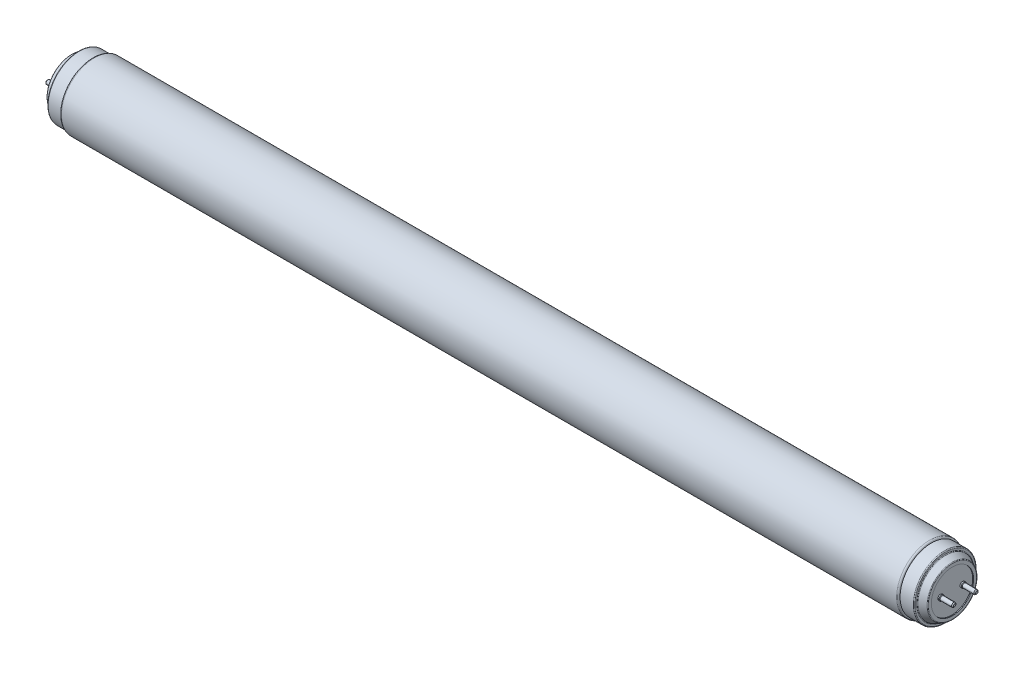
ISO-10303-21;
HEADER;
FILE_DESCRIPTION(('STEP AP214'),'2;1');
FILE_NAME('part.step','',(''),(''),'','','');
FILE_SCHEMA(('AUTOMOTIVE_DESIGN { 1 0 10303 214 1 1 1 1 }'));
ENDSEC;
DATA;
#1=APPLICATION_CONTEXT('core data for automotive mechanical design processes');
#2=APPLICATION_PROTOCOL_DEFINITION('international standard','automotive_design',2000,#1);
#3=PRODUCT_CONTEXT('',#1,'mechanical');
#4=PRODUCT('Part','Part','',(#3));
#5=PRODUCT_RELATED_PRODUCT_CATEGORY('part','',(#4));
#6=PRODUCT_DEFINITION_FORMATION('','',#4);
#7=PRODUCT_DEFINITION_CONTEXT('part definition',#1,'design');
#8=PRODUCT_DEFINITION('design','',#6,#7);
#9=PRODUCT_DEFINITION_SHAPE('','',#8);
#10=(LENGTH_UNIT() NAMED_UNIT(*) SI_UNIT(.MILLI.,.METRE.));
#11=(NAMED_UNIT(*) PLANE_ANGLE_UNIT() SI_UNIT($,.RADIAN.));
#12=(NAMED_UNIT(*) SI_UNIT($,.STERADIAN.) SOLID_ANGLE_UNIT());
#13=UNCERTAINTY_MEASURE_WITH_UNIT(LENGTH_MEASURE(1.E-05),#10,'distance_accuracy_value','');
#14=(GEOMETRIC_REPRESENTATION_CONTEXT(3) GLOBAL_UNCERTAINTY_ASSIGNED_CONTEXT((#13)) GLOBAL_UNIT_ASSIGNED_CONTEXT((#10,
#11,#12)) REPRESENTATION_CONTEXT('',''));
#15=CARTESIAN_POINT('',(0.,0.,0.));
#16=DIRECTION('',(0.,0.,1.));
#17=DIRECTION('',(1.,0.,0.));
#18=AXIS2_PLACEMENT_3D('',#15,#16,#17);
#19=CARTESIAN_POINT('',(487.5,-12.,0.));
#20=DIRECTION('',(-1.,0.,0.));
#21=DIRECTION('',(0.,0.,1.));
#22=AXIS2_PLACEMENT_3D('',#19,#20,#21);
#23=PLANE('',#22);
#24=CARTESIAN_POINT('',(487.5,0.,-6.3));
#25=DIRECTION('',(-1.,0.,0.));
#26=DIRECTION('',(0.,0.,1.));
#27=AXIS2_PLACEMENT_3D('',#24,#25,#26);
#28=CIRCLE('',#27,1.5);
#29=CARTESIAN_POINT('',(487.5,0.,-4.8));
#30=VERTEX_POINT('',#29);
#31=EDGE_CURVE('E77',#30,#30,#28,.F.);
#32=ORIENTED_EDGE('',*,*,#31,.F.);
#33=EDGE_LOOP('',(#32));
#34=FACE_BOUND('',#33,.T.);
#35=CARTESIAN_POINT('',(487.5,0.,0.));
#36=DIRECTION('',(1.,0.,0.));
#37=DIRECTION('',(0.,0.,-1.));
#38=AXIS2_PLACEMENT_3D('',#35,#36,#37);
#39=CIRCLE('',#38,12.);
#40=CARTESIAN_POINT('',(487.5,0.,-12.));
#41=VERTEX_POINT('',#40);
#42=EDGE_CURVE('E99',#41,#41,#39,.T.);
#43=ORIENTED_EDGE('',*,*,#42,.T.);
#44=EDGE_LOOP('',(#43));
#45=FACE_BOUND('',#44,.T.);
#46=CARTESIAN_POINT('',(487.5,0.,6.3));
#47=DIRECTION('',(-1.,0.,0.));
#48=DIRECTION('',(0.,0.,1.));
#49=AXIS2_PLACEMENT_3D('',#46,#47,#48);
#50=CIRCLE('',#49,1.5);
#51=CARTESIAN_POINT('',(487.5,0.,7.8));
#52=VERTEX_POINT('',#51);
#53=EDGE_CURVE('E74',#52,#52,#50,.F.);
#54=ORIENTED_EDGE('',*,*,#53,.F.);
#55=EDGE_LOOP('',(#54));
#56=FACE_BOUND('',#55,.T.);
#57=ADVANCED_FACE('F30',(#34,#45,#56),#23,.F.);
#58=CARTESIAN_POINT('',(-11.5,-12.,0.));
#59=DIRECTION('',(1.,0.,0.));
#60=DIRECTION('',(0.,0.,-1.));
#61=AXIS2_PLACEMENT_3D('',#58,#59,#60);
#62=PLANE('',#61);
#63=CARTESIAN_POINT('',(-11.5,0.,-6.3));
#64=DIRECTION('',(1.,0.,0.));
#65=DIRECTION('',(0.,0.,-1.));
#66=AXIS2_PLACEMENT_3D('',#63,#64,#65);
#67=CIRCLE('',#66,1.5);
#68=CARTESIAN_POINT('',(-11.5,0.,-7.8));
#69=VERTEX_POINT('',#68);
#70=EDGE_CURVE('E90',#69,#69,#67,.F.);
#71=ORIENTED_EDGE('',*,*,#70,.F.);
#72=EDGE_LOOP('',(#71));
#73=FACE_BOUND('',#72,.T.);
#74=CARTESIAN_POINT('',(-11.5,0.,0.));
#75=DIRECTION('',(1.,0.,0.));
#76=DIRECTION('',(0.,0.,-1.));
#77=AXIS2_PLACEMENT_3D('',#74,#75,#76);
#78=CIRCLE('',#77,12.);
#79=CARTESIAN_POINT('',(-11.5,0.,-12.));
#80=VERTEX_POINT('',#79);
#81=EDGE_CURVE('E96',#80,#80,#78,.T.);
#82=ORIENTED_EDGE('',*,*,#81,.F.);
#83=EDGE_LOOP('',(#82));
#84=FACE_BOUND('',#83,.T.);
#85=CARTESIAN_POINT('',(-11.5,0.,6.3));
#86=DIRECTION('',(1.,0.,0.));
#87=DIRECTION('',(0.,0.,-1.));
#88=AXIS2_PLACEMENT_3D('',#85,#86,#87);
#89=CIRCLE('',#88,1.5);
#90=CARTESIAN_POINT('',(-11.5,0.,4.8));
#91=VERTEX_POINT('',#90);
#92=EDGE_CURVE('E84',#91,#91,#89,.F.);
#93=ORIENTED_EDGE('',*,*,#92,.F.);
#94=EDGE_LOOP('',(#93));
#95=FACE_BOUND('',#94,.T.);
#96=ADVANCED_FACE('F273',(#73,#84,#95),#62,.F.);
#97=CARTESIAN_POINT('',(-11.5,0.,0.));
#98=DIRECTION('',(1.,0.,0.));
#99=DIRECTION('',(0.,0.,-1.));
#100=AXIS2_PLACEMENT_3D('',#97,#98,#99);
#101=CYLINDRICAL_SURFACE('',#100,12.);
#102=CARTESIAN_POINT('',(-12.,0.,0.));
#103=DIRECTION('',(1.,0.,0.));
#104=DIRECTION('',(0.,0.,-1.));
#105=AXIS2_PLACEMENT_3D('',#102,#103,#104);
#106=CIRCLE('',#105,12.);
#107=CARTESIAN_POINT('',(-12.,0.,-12.));
#108=VERTEX_POINT('',#107);
#109=EDGE_CURVE('E102',#108,#108,#106,.T.);
#110=ORIENTED_EDGE('',*,*,#109,.F.);
#111=EDGE_LOOP('',(#110));
#112=FACE_BOUND('',#111,.T.);
#113=ORIENTED_EDGE('',*,*,#81,.T.);
#114=EDGE_LOOP('',(#113));
#115=FACE_BOUND('',#114,.T.);
#116=ADVANCED_FACE('F267',(#112,#115),#101,.F.);
#117=CARTESIAN_POINT('',(-12.,-13.6909830056251,0.));
#118=DIRECTION('',(1.,0.,0.));
#119=DIRECTION('',(0.,0.,-1.));
#120=AXIS2_PLACEMENT_3D('',#117,#118,#119);
#121=PLANE('',#120);
#122=CARTESIAN_POINT('',(-12.,0.,0.));
#123=DIRECTION('',(1.,0.,0.));
#124=DIRECTION('',(0.,0.,-1.));
#125=AXIS2_PLACEMENT_3D('',#122,#123,#124);
#126=CIRCLE('',#125,13.6909830056251);
#127=CARTESIAN_POINT('',(-12.,0.,-13.6909830056251));
#128=VERTEX_POINT('',#127);
#129=EDGE_CURVE('E105',#128,#128,#126,.T.);
#130=ORIENTED_EDGE('',*,*,#129,.F.);
#131=EDGE_LOOP('',(#130));
#132=FACE_BOUND('',#131,.T.);
#133=ORIENTED_EDGE('',*,*,#109,.T.);
#134=EDGE_LOOP('',(#133));
#135=FACE_BOUND('',#134,.T.);
#136=ADVANCED_FACE('F261',(#132,#135),#121,.F.);
#137=CARTESIAN_POINT('',(-11.5,0.,0.));
#138=DIRECTION('',(1.,0.,0.));
#139=DIRECTION('',(0.,0.,-1.));
#140=AXIS2_PLACEMENT_3D('',#137,#138,#139);
#141=TOROIDAL_SURFACE('',#140,13.6909830056251,0.5);
#142=CARTESIAN_POINT('',(-11.72360679775,0.,0.));
#143=DIRECTION('',(1.,0.,0.));
#144=DIRECTION('',(0.,0.,-1.));
#145=AXIS2_PLACEMENT_3D('',#142,#143,#144);
#146=CIRCLE('',#145,14.138196601125);
#147=CARTESIAN_POINT('',(-11.72360679775,0.,-14.138196601125));
#148=VERTEX_POINT('',#147);
#149=EDGE_CURVE('E108',#148,#148,#146,.T.);
#150=ORIENTED_EDGE('',*,*,#149,.F.);
#151=EDGE_LOOP('',(#150));
#152=FACE_BOUND('',#151,.T.);
#153=ORIENTED_EDGE('',*,*,#129,.T.);
#154=EDGE_LOOP('',(#153));
#155=FACE_BOUND('',#154,.T.);
#156=ADVANCED_FACE('F255',(#152,#155),#141,.T.);
#157=CARTESIAN_POINT('',(-11.72360679775,0.,0.));
#158=DIRECTION('',(1.,0.,0.));
#159=DIRECTION('',(0.,0.,-1.));
#160=AXIS2_PLACEMENT_3D('',#157,#158,#159);
#161=CONICAL_SURFACE('',#160,14.138196601125,0.463647609000806);
#162=CARTESIAN_POINT('',(-8.27639320225002,0.,0.));
#163=DIRECTION('',(1.,0.,0.));
#164=DIRECTION('',(0.,0.,-1.));
#165=AXIS2_PLACEMENT_3D('',#162,#163,#164);
#166=CIRCLE('',#165,15.861803398875);
#167=CARTESIAN_POINT('',(-8.27639320225002,0.,-15.861803398875));
#168=VERTEX_POINT('',#167);
#169=EDGE_CURVE('E111',#168,#168,#166,.T.);
#170=ORIENTED_EDGE('',*,*,#169,.F.);
#171=EDGE_LOOP('',(#170));
#172=FACE_BOUND('',#171,.T.);
#173=ORIENTED_EDGE('',*,*,#149,.T.);
#174=EDGE_LOOP('',(#173));
#175=FACE_BOUND('',#174,.T.);
#176=ADVANCED_FACE('F249',(#172,#175),#161,.T.);
#177=CARTESIAN_POINT('',(-8.5,0.,0.));
#178=DIRECTION('',(1.,0.,0.));
#179=DIRECTION('',(0.,0.,-1.));
#180=AXIS2_PLACEMENT_3D('',#177,#178,#179);
#181=TOROIDAL_SURFACE('',#180,16.309016994375,0.500000000000001);
#182=CARTESIAN_POINT('',(-8.,0.,0.));
#183=DIRECTION('',(1.,0.,0.));
#184=DIRECTION('',(0.,0.,-1.));
#185=AXIS2_PLACEMENT_3D('',#182,#183,#184);
#186=CIRCLE('',#185,16.309016994375);
#187=CARTESIAN_POINT('',(-8.,0.,-16.309016994375));
#188=VERTEX_POINT('',#187);
#189=EDGE_CURVE('E114',#188,#188,#186,.T.);
#190=ORIENTED_EDGE('',*,*,#189,.F.);
#191=EDGE_LOOP('',(#190));
#192=FACE_BOUND('',#191,.T.);
#193=ORIENTED_EDGE('',*,*,#169,.T.);
#194=EDGE_LOOP('',(#193));
#195=FACE_BOUND('',#194,.T.);
#196=ADVANCED_FACE('F243',(#192,#195),#181,.F.);
#197=CARTESIAN_POINT('',(-8.,-17.25,0.));
#198=DIRECTION('',(1.,0.,0.));
#199=DIRECTION('',(0.,0.,-1.));
#200=AXIS2_PLACEMENT_3D('',#197,#198,#199);
#201=PLANE('',#200);
#202=CARTESIAN_POINT('',(-8.,0.,0.));
#203=DIRECTION('',(1.,0.,0.));
#204=DIRECTION('',(0.,0.,-1.));
#205=AXIS2_PLACEMENT_3D('',#202,#203,#204);
#206=CIRCLE('',#205,17.25);
#207=CARTESIAN_POINT('',(-8.,0.,-17.25));
#208=VERTEX_POINT('',#207);
#209=EDGE_CURVE('E117',#208,#208,#206,.T.);
#210=ORIENTED_EDGE('',*,*,#209,.F.);
#211=EDGE_LOOP('',(#210));
#212=FACE_BOUND('',#211,.T.);
#213=ORIENTED_EDGE('',*,*,#189,.T.);
#214=EDGE_LOOP('',(#213));
#215=FACE_BOUND('',#214,.T.);
#216=ADVANCED_FACE('F237',(#212,#215),#201,.F.);
#217=CARTESIAN_POINT('',(-7.5,0.,0.));
#218=DIRECTION('',(1.,0.,0.));
#219=DIRECTION('',(0.,0.,-1.));
#220=AXIS2_PLACEMENT_3D('',#217,#218,#219);
#221=TOROIDAL_SURFACE('',#220,17.25,0.5);
#222=CARTESIAN_POINT('',(-7.49999999999999,0.,0.));
#223=DIRECTION('',(1.,0.,0.));
#224=DIRECTION('',(0.,0.,-1.));
#225=AXIS2_PLACEMENT_3D('',#222,#223,#224);
#226=CIRCLE('',#225,17.75);
#227=CARTESIAN_POINT('',(-7.49999999999999,0.,-17.75));
#228=VERTEX_POINT('',#227);
#229=EDGE_CURVE('E120',#228,#228,#226,.T.);
#230=ORIENTED_EDGE('',*,*,#229,.F.);
#231=EDGE_LOOP('',(#230));
#232=FACE_BOUND('',#231,.T.);
#233=ORIENTED_EDGE('',*,*,#209,.T.);
#234=EDGE_LOOP('',(#233));
#235=FACE_BOUND('',#234,.T.);
#236=ADVANCED_FACE('F231',(#232,#235),#221,.T.);
#237=CARTESIAN_POINT('',(-11.5,0.,0.));
#238=DIRECTION('',(1.,0.,0.));
#239=DIRECTION('',(0.,0.,-1.));
#240=AXIS2_PLACEMENT_3D('',#237,#238,#239);
#241=CYLINDRICAL_SURFACE('',#240,17.75);
#242=CARTESIAN_POINT('',(0.,0.,0.));
#243=DIRECTION('',(1.,0.,0.));
#244=DIRECTION('',(0.,0.,-1.));
#245=AXIS2_PLACEMENT_3D('',#242,#243,#244);
#246=CIRCLE('',#245,17.75);
#247=CARTESIAN_POINT('',(0.,0.,-17.75));
#248=VERTEX_POINT('',#247);
#249=EDGE_CURVE('E123',#248,#248,#246,.T.);
#250=ORIENTED_EDGE('',*,*,#249,.F.);
#251=EDGE_LOOP('',(#250));
#252=FACE_BOUND('',#251,.T.);
#253=ORIENTED_EDGE('',*,*,#229,.T.);
#254=EDGE_LOOP('',(#253));
#255=FACE_BOUND('',#254,.T.);
#256=ADVANCED_FACE('F225',(#252,#255),#241,.T.);
#257=CARTESIAN_POINT('',(0.950000000000002,0.,0.));
#258=DIRECTION('',(1.,0.,0.));
#259=DIRECTION('',(0.,0.,-1.));
#260=AXIS2_PLACEMENT_3D('',#257,#258,#259);
#261=TOROIDAL_SURFACE('',#260,17.75,0.950000000000001);
#262=CARTESIAN_POINT('',(0.950000000000001,0.,0.));
#263=DIRECTION('',(1.,0.,0.));
#264=DIRECTION('',(0.,0.,-1.));
#265=AXIS2_PLACEMENT_3D('',#262,#263,#264);
#266=CIRCLE('',#265,18.7);
#267=CARTESIAN_POINT('',(0.950000000000001,0.,-18.7));
#268=VERTEX_POINT('',#267);
#269=EDGE_CURVE('E126',#268,#268,#266,.T.);
#270=ORIENTED_EDGE('',*,*,#269,.F.);
#271=EDGE_LOOP('',(#270));
#272=FACE_BOUND('',#271,.T.);
#273=ORIENTED_EDGE('',*,*,#249,.T.);
#274=EDGE_LOOP('',(#273));
#275=FACE_BOUND('',#274,.T.);
#276=ADVANCED_FACE('F219',(#272,#275),#261,.T.);
#277=CARTESIAN_POINT('',(-11.5,0.,0.));
#278=DIRECTION('',(1.,0.,0.));
#279=DIRECTION('',(0.,0.,-1.));
#280=AXIS2_PLACEMENT_3D('',#277,#278,#279);
#281=CYLINDRICAL_SURFACE('',#280,18.7);
#282=CARTESIAN_POINT('',(475.05,0.,0.));
#283=DIRECTION('',(1.,0.,0.));
#284=DIRECTION('',(0.,0.,-1.));
#285=AXIS2_PLACEMENT_3D('',#282,#283,#284);
#286=CIRCLE('',#285,18.7);
#287=CARTESIAN_POINT('',(475.05,0.,-18.7));
#288=VERTEX_POINT('',#287);
#289=EDGE_CURVE('E129',#288,#288,#286,.T.);
#290=ORIENTED_EDGE('',*,*,#289,.F.);
#291=EDGE_LOOP('',(#290));
#292=FACE_BOUND('',#291,.T.);
#293=ORIENTED_EDGE('',*,*,#269,.T.);
#294=EDGE_LOOP('',(#293));
#295=FACE_BOUND('',#294,.T.);
#296=ADVANCED_FACE('F213',(#292,#295),#281,.T.);
#297=CARTESIAN_POINT('',(475.05,0.,0.));
#298=DIRECTION('',(1.,0.,0.));
#299=DIRECTION('',(0.,0.,-1.));
#300=AXIS2_PLACEMENT_3D('',#297,#298,#299);
#301=TOROIDAL_SURFACE('',#300,17.75,0.950000000000005);
#302=CARTESIAN_POINT('',(476.,0.,0.));
#303=DIRECTION('',(1.,0.,0.));
#304=DIRECTION('',(0.,0.,-1.));
#305=AXIS2_PLACEMENT_3D('',#302,#303,#304);
#306=CIRCLE('',#305,17.75);
#307=CARTESIAN_POINT('',(476.,0.,-17.75));
#308=VERTEX_POINT('',#307);
#309=EDGE_CURVE('E132',#308,#308,#306,.T.);
#310=ORIENTED_EDGE('',*,*,#309,.F.);
#311=EDGE_LOOP('',(#310));
#312=FACE_BOUND('',#311,.T.);
#313=ORIENTED_EDGE('',*,*,#289,.T.);
#314=EDGE_LOOP('',(#313));
#315=FACE_BOUND('',#314,.T.);
#316=ADVANCED_FACE('F207',(#312,#315),#301,.T.);
#317=CARTESIAN_POINT('',(-11.5,0.,0.));
#318=DIRECTION('',(1.,0.,0.));
#319=DIRECTION('',(0.,0.,-1.));
#320=AXIS2_PLACEMENT_3D('',#317,#318,#319);
#321=CYLINDRICAL_SURFACE('',#320,17.75);
#322=CARTESIAN_POINT('',(483.5,0.,0.));
#323=DIRECTION('',(1.,0.,0.));
#324=DIRECTION('',(0.,0.,-1.));
#325=AXIS2_PLACEMENT_3D('',#322,#323,#324);
#326=CIRCLE('',#325,17.75);
#327=CARTESIAN_POINT('',(483.5,0.,-17.75));
#328=VERTEX_POINT('',#327);
#329=EDGE_CURVE('E135',#328,#328,#326,.T.);
#330=ORIENTED_EDGE('',*,*,#329,.F.);
#331=EDGE_LOOP('',(#330));
#332=FACE_BOUND('',#331,.T.);
#333=ORIENTED_EDGE('',*,*,#309,.T.);
#334=EDGE_LOOP('',(#333));
#335=FACE_BOUND('',#334,.T.);
#336=ADVANCED_FACE('F201',(#332,#335),#321,.T.);
#337=CARTESIAN_POINT('',(483.5,0.,0.));
#338=DIRECTION('',(1.,0.,0.));
#339=DIRECTION('',(0.,0.,-1.));
#340=AXIS2_PLACEMENT_3D('',#337,#338,#339);
#341=TOROIDAL_SURFACE('',#340,17.25,0.500000000000002);
#342=CARTESIAN_POINT('',(484.,0.,0.));
#343=DIRECTION('',(1.,0.,0.));
#344=DIRECTION('',(0.,0.,-1.));
#345=AXIS2_PLACEMENT_3D('',#342,#343,#344);
#346=CIRCLE('',#345,17.25);
#347=CARTESIAN_POINT('',(484.,0.,-17.25));
#348=VERTEX_POINT('',#347);
#349=EDGE_CURVE('E138',#348,#348,#346,.T.);
#350=ORIENTED_EDGE('',*,*,#349,.F.);
#351=EDGE_LOOP('',(#350));
#352=FACE_BOUND('',#351,.T.);
#353=ORIENTED_EDGE('',*,*,#329,.T.);
#354=EDGE_LOOP('',(#353));
#355=FACE_BOUND('',#354,.T.);
#356=ADVANCED_FACE('F195',(#352,#355),#341,.T.);
#357=CARTESIAN_POINT('',(484.,-17.25,0.));
#358=DIRECTION('',(-1.,0.,0.));
#359=DIRECTION('',(0.,0.,1.));
#360=AXIS2_PLACEMENT_3D('',#357,#358,#359);
#361=PLANE('',#360);
#362=CARTESIAN_POINT('',(484.,0.,0.));
#363=DIRECTION('',(1.,0.,0.));
#364=DIRECTION('',(0.,0.,-1.));
#365=AXIS2_PLACEMENT_3D('',#362,#363,#364);
#366=CIRCLE('',#365,16.3090169943749);
#367=CARTESIAN_POINT('',(484.,0.,-16.3090169943749));
#368=VERTEX_POINT('',#367);
#369=EDGE_CURVE('E141',#368,#368,#366,.T.);
#370=ORIENTED_EDGE('',*,*,#369,.F.);
#371=EDGE_LOOP('',(#370));
#372=FACE_BOUND('',#371,.T.);
#373=ORIENTED_EDGE('',*,*,#349,.T.);
#374=EDGE_LOOP('',(#373));
#375=FACE_BOUND('',#374,.T.);
#376=ADVANCED_FACE('F189',(#372,#375),#361,.F.);
#377=CARTESIAN_POINT('',(484.5,0.,0.));
#378=DIRECTION('',(1.,0.,0.));
#379=DIRECTION('',(0.,0.,-1.));
#380=AXIS2_PLACEMENT_3D('',#377,#378,#379);
#381=TOROIDAL_SURFACE('',#380,16.3090169943749,0.500000000000009);
#382=CARTESIAN_POINT('',(484.27639320225,0.,0.));
#383=DIRECTION('',(1.,0.,0.));
#384=DIRECTION('',(0.,0.,-1.));
#385=AXIS2_PLACEMENT_3D('',#382,#383,#384);
#386=CIRCLE('',#385,15.861803398875);
#387=CARTESIAN_POINT('',(484.27639320225,0.,-15.861803398875));
#388=VERTEX_POINT('',#387);
#389=EDGE_CURVE('E144',#388,#388,#386,.T.);
#390=ORIENTED_EDGE('',*,*,#389,.F.);
#391=EDGE_LOOP('',(#390));
#392=FACE_BOUND('',#391,.T.);
#393=ORIENTED_EDGE('',*,*,#369,.T.);
#394=EDGE_LOOP('',(#393));
#395=FACE_BOUND('',#394,.T.);
#396=ADVANCED_FACE('F183',(#392,#395),#381,.F.);
#397=CARTESIAN_POINT('',(484.27639320225,0.,0.));
#398=DIRECTION('',(-1.,0.,0.));
#399=DIRECTION('',(0.,0.,1.));
#400=AXIS2_PLACEMENT_3D('',#397,#398,#399);
#401=CONICAL_SURFACE('',#400,15.861803398875,0.463647609000805);
#402=CARTESIAN_POINT('',(487.72360679775,0.,0.));
#403=DIRECTION('',(1.,0.,0.));
#404=DIRECTION('',(0.,0.,-1.));
#405=AXIS2_PLACEMENT_3D('',#402,#403,#404);
#406=CIRCLE('',#405,14.138196601125);
#407=CARTESIAN_POINT('',(487.72360679775,0.,-14.138196601125));
#408=VERTEX_POINT('',#407);
#409=EDGE_CURVE('E147',#408,#408,#406,.T.);
#410=ORIENTED_EDGE('',*,*,#409,.F.);
#411=EDGE_LOOP('',(#410));
#412=FACE_BOUND('',#411,.T.);
#413=ORIENTED_EDGE('',*,*,#389,.T.);
#414=EDGE_LOOP('',(#413));
#415=FACE_BOUND('',#414,.T.);
#416=ADVANCED_FACE('F177',(#412,#415),#401,.T.);
#417=CARTESIAN_POINT('',(487.5,0.,0.));
#418=DIRECTION('',(1.,0.,0.));
#419=DIRECTION('',(0.,0.,-1.));
#420=AXIS2_PLACEMENT_3D('',#417,#418,#419);
#421=TOROIDAL_SURFACE('',#420,13.6909830056251,0.499999999999997);
#422=CARTESIAN_POINT('',(488.,0.,0.));
#423=DIRECTION('',(1.,0.,0.));
#424=DIRECTION('',(0.,0.,-1.));
#425=AXIS2_PLACEMENT_3D('',#422,#423,#424);
#426=CIRCLE('',#425,13.6909830056251);
#427=CARTESIAN_POINT('',(488.,0.,-13.6909830056251));
#428=VERTEX_POINT('',#427);
#429=EDGE_CURVE('E150',#428,#428,#426,.T.);
#430=ORIENTED_EDGE('',*,*,#429,.F.);
#431=EDGE_LOOP('',(#430));
#432=FACE_BOUND('',#431,.T.);
#433=ORIENTED_EDGE('',*,*,#409,.T.);
#434=EDGE_LOOP('',(#433));
#435=FACE_BOUND('',#434,.T.);
#436=ADVANCED_FACE('F171',(#432,#435),#421,.T.);
#437=CARTESIAN_POINT('',(488.,-13.6909830056251,0.));
#438=DIRECTION('',(-1.,0.,0.));
#439=DIRECTION('',(0.,0.,1.));
#440=AXIS2_PLACEMENT_3D('',#437,#438,#439);
#441=PLANE('',#440);
#442=CARTESIAN_POINT('',(488.,0.,0.));
#443=DIRECTION('',(1.,0.,0.));
#444=DIRECTION('',(0.,0.,-1.));
#445=AXIS2_PLACEMENT_3D('',#442,#443,#444);
#446=CIRCLE('',#445,12.);
#447=CARTESIAN_POINT('',(488.,0.,-12.));
#448=VERTEX_POINT('',#447);
#449=EDGE_CURVE('E153',#448,#448,#446,.T.);
#450=ORIENTED_EDGE('',*,*,#449,.F.);
#451=EDGE_LOOP('',(#450));
#452=FACE_BOUND('',#451,.T.);
#453=ORIENTED_EDGE('',*,*,#429,.T.);
#454=EDGE_LOOP('',(#453));
#455=FACE_BOUND('',#454,.T.);
#456=ADVANCED_FACE('F165',(#452,#455),#441,.F.);
#457=CARTESIAN_POINT('',(-11.5,0.,0.));
#458=DIRECTION('',(1.,0.,0.));
#459=DIRECTION('',(0.,0.,-1.));
#460=AXIS2_PLACEMENT_3D('',#457,#458,#459);
#461=CYLINDRICAL_SURFACE('',#460,12.);
#462=ORIENTED_EDGE('',*,*,#42,.F.);
#463=EDGE_LOOP('',(#462));
#464=FACE_BOUND('',#463,.T.);
#465=ORIENTED_EDGE('',*,*,#449,.T.);
#466=EDGE_LOOP('',(#465));
#467=FACE_BOUND('',#466,.T.);
#468=ADVANCED_FACE('F161',(#464,#467),#461,.F.);
#469=CARTESIAN_POINT('',(-12.5,0.,-6.3));
#470=DIRECTION('',(1.,0.,0.));
#471=DIRECTION('',(0.,0.,-1.));
#472=AXIS2_PLACEMENT_3D('',#469,#470,#471);
#473=CYLINDRICAL_SURFACE('',#472,1.5);
#474=CARTESIAN_POINT('',(-12.1999999999999,0.,-6.3));
#475=DIRECTION('',(-1.,0.,0.));
#476=DIRECTION('',(0.,0.,1.));
#477=AXIS2_PLACEMENT_3D('',#474,#475,#476);
#478=CIRCLE('',#477,1.5);
#479=CARTESIAN_POINT('',(-12.1999999999999,0.,-4.8));
#480=VERTEX_POINT('',#479);
#481=EDGE_CURVE('E62',#480,#480,#478,.F.);
#482=ORIENTED_EDGE('',*,*,#481,.T.);
#483=EDGE_LOOP('',(#482));
#484=FACE_BOUND('',#483,.T.);
#485=ORIENTED_EDGE('',*,*,#70,.T.);
#486=EDGE_LOOP('',(#485));
#487=FACE_BOUND('',#486,.T.);
#488=ADVANCED_FACE('F164',(#484,#487),#473,.T.);
#489=CARTESIAN_POINT('',(-19.5,0.,-6.3));
#490=DIRECTION('',(-1.,0.,0.));
#491=DIRECTION('',(0.,0.,1.));
#492=AXIS2_PLACEMENT_3D('',#489,#490,#491);
#493=PLANE('',#492);
#494=CARTESIAN_POINT('',(-19.5,0.,-6.3));
#495=DIRECTION('',(-1.,0.,0.));
#496=DIRECTION('',(0.,0.,1.));
#497=AXIS2_PLACEMENT_3D('',#494,#495,#496);
#498=CIRCLE('',#497,0.700000000000089);
#499=CARTESIAN_POINT('',(-19.5,0.,-5.59999999999991));
#500=VERTEX_POINT('',#499);
#501=EDGE_CURVE('E37',#500,#500,#498,.T.);
#502=ORIENTED_EDGE('',*,*,#501,.T.);
#503=EDGE_LOOP('',(#502));
#504=FACE_BOUND('',#503,.T.);
#505=ADVANCED_FACE('F296',(#504),#493,.T.);
#506=CARTESIAN_POINT('',(-19.5,0.,-6.3));
#507=DIRECTION('',(1.,0.,0.));
#508=DIRECTION('',(0.,0.,-1.));
#509=AXIS2_PLACEMENT_3D('',#506,#507,#508);
#510=CYLINDRICAL_SURFACE('',#509,1.2);
#511=CARTESIAN_POINT('',(-19.0000000000001,0.,-6.3));
#512=DIRECTION('',(-1.,0.,0.));
#513=DIRECTION('',(0.,0.,1.));
#514=AXIS2_PLACEMENT_3D('',#511,#512,#513);
#515=CIRCLE('',#514,1.2);
#516=CARTESIAN_POINT('',(-19.0000000000001,0.,-5.1));
#517=VERTEX_POINT('',#516);
#518=EDGE_CURVE('E10',#517,#517,#515,.F.);
#519=ORIENTED_EDGE('',*,*,#518,.T.);
#520=EDGE_LOOP('',(#519));
#521=FACE_BOUND('',#520,.T.);
#522=CARTESIAN_POINT('',(-12.5,0.,-6.3));
#523=DIRECTION('',(-1.,0.,0.));
#524=DIRECTION('',(0.,0.,1.));
#525=AXIS2_PLACEMENT_3D('',#522,#523,#524);
#526=CIRCLE('',#525,1.2);
#527=CARTESIAN_POINT('',(-12.5,0.,-5.1));
#528=VERTEX_POINT('',#527);
#529=EDGE_CURVE('E93',#528,#528,#526,.T.);
#530=ORIENTED_EDGE('',*,*,#529,.T.);
#531=EDGE_LOOP('',(#530));
#532=FACE_BOUND('',#531,.T.);
#533=ADVANCED_FACE('F286',(#521,#532),#510,.T.);
#534=CARTESIAN_POINT('',(-12.5,0.,6.3));
#535=DIRECTION('',(1.,0.,0.));
#536=DIRECTION('',(0.,0.,-1.));
#537=AXIS2_PLACEMENT_3D('',#534,#535,#536);
#538=CYLINDRICAL_SURFACE('',#537,1.5);
#539=CARTESIAN_POINT('',(-12.1999999999999,0.,6.3));
#540=DIRECTION('',(-1.,0.,0.));
#541=DIRECTION('',(0.,0.,1.));
#542=AXIS2_PLACEMENT_3D('',#539,#540,#541);
#543=CIRCLE('',#542,1.5);
#544=CARTESIAN_POINT('',(-12.1999999999999,0.,7.8));
#545=VERTEX_POINT('',#544);
#546=EDGE_CURVE('E65',#545,#545,#543,.F.);
#547=ORIENTED_EDGE('',*,*,#546,.T.);
#548=EDGE_LOOP('',(#547));
#549=FACE_BOUND('',#548,.T.);
#550=ORIENTED_EDGE('',*,*,#92,.T.);
#551=EDGE_LOOP('',(#550));
#552=FACE_BOUND('',#551,.T.);
#553=ADVANCED_FACE('F283',(#549,#552),#538,.T.);
#554=CARTESIAN_POINT('',(-19.5,0.,6.3));
#555=DIRECTION('',(-1.,0.,0.));
#556=DIRECTION('',(0.,0.,1.));
#557=AXIS2_PLACEMENT_3D('',#554,#555,#556);
#558=PLANE('',#557);
#559=CARTESIAN_POINT('',(-19.5,0.,6.3));
#560=DIRECTION('',(-1.,0.,0.));
#561=DIRECTION('',(0.,0.,1.));
#562=AXIS2_PLACEMENT_3D('',#559,#560,#561);
#563=CIRCLE('',#562,0.700000000000089);
#564=CARTESIAN_POINT('',(-19.5,0.,7.00000000000009));
#565=VERTEX_POINT('',#564);
#566=EDGE_CURVE('E45',#565,#565,#563,.T.);
#567=ORIENTED_EDGE('',*,*,#566,.T.);
#568=EDGE_LOOP('',(#567));
#569=FACE_BOUND('',#568,.T.);
#570=ADVANCED_FACE('F285',(#569),#558,.T.);
#571=CARTESIAN_POINT('',(-19.5,0.,6.3));
#572=DIRECTION('',(1.,0.,0.));
#573=DIRECTION('',(0.,0.,-1.));
#574=AXIS2_PLACEMENT_3D('',#571,#572,#573);
#575=CYLINDRICAL_SURFACE('',#574,1.2);
#576=CARTESIAN_POINT('',(-19.0000000000001,0.,6.3));
#577=DIRECTION('',(-1.,0.,0.));
#578=DIRECTION('',(0.,0.,1.));
#579=AXIS2_PLACEMENT_3D('',#576,#577,#578);
#580=CIRCLE('',#579,1.2);
#581=CARTESIAN_POINT('',(-19.0000000000001,0.,7.5));
#582=VERTEX_POINT('',#581);
#583=EDGE_CURVE('E41',#582,#582,#580,.F.);
#584=ORIENTED_EDGE('',*,*,#583,.T.);
#585=EDGE_LOOP('',(#584));
#586=FACE_BOUND('',#585,.T.);
#587=CARTESIAN_POINT('',(-12.5,0.,6.3));
#588=DIRECTION('',(-1.,0.,0.));
#589=DIRECTION('',(0.,0.,1.));
#590=AXIS2_PLACEMENT_3D('',#587,#588,#589);
#591=CIRCLE('',#590,1.2);
#592=CARTESIAN_POINT('',(-12.5,0.,7.5));
#593=VERTEX_POINT('',#592);
#594=EDGE_CURVE('E87',#593,#593,#591,.T.);
#595=ORIENTED_EDGE('',*,*,#594,.T.);
#596=EDGE_LOOP('',(#595));
#597=FACE_BOUND('',#596,.T.);
#598=ADVANCED_FACE('F293',(#586,#597),#575,.T.);
#599=CARTESIAN_POINT('',(488.5,0.,-6.3));
#600=DIRECTION('',(-1.,0.,0.));
#601=DIRECTION('',(0.,0.,1.));
#602=AXIS2_PLACEMENT_3D('',#599,#600,#601);
#603=CYLINDRICAL_SURFACE('',#602,1.5);
#604=CARTESIAN_POINT('',(488.2,0.,-6.3));
#605=DIRECTION('',(1.,0.,0.));
#606=DIRECTION('',(0.,0.,-1.));
#607=AXIS2_PLACEMENT_3D('',#604,#605,#606);
#608=CIRCLE('',#607,1.5);
#609=CARTESIAN_POINT('',(488.2,0.,-7.8));
#610=VERTEX_POINT('',#609);
#611=EDGE_CURVE('E71',#610,#610,#608,.F.);
#612=ORIENTED_EDGE('',*,*,#611,.T.);
#613=EDGE_LOOP('',(#612));
#614=FACE_BOUND('',#613,.T.);
#615=ORIENTED_EDGE('',*,*,#31,.T.);
#616=EDGE_LOOP('',(#615));
#617=FACE_BOUND('',#616,.T.);
#618=ADVANCED_FACE('F345',(#614,#617),#603,.T.);
#619=CARTESIAN_POINT('',(495.5,0.,-6.3));
#620=DIRECTION('',(1.,0.,0.));
#621=DIRECTION('',(0.,0.,-1.));
#622=AXIS2_PLACEMENT_3D('',#619,#620,#621);
#623=PLANE('',#622);
#624=CARTESIAN_POINT('',(495.5,0.,-6.3));
#625=DIRECTION('',(1.,0.,0.));
#626=DIRECTION('',(0.,0.,-1.));
#627=AXIS2_PLACEMENT_3D('',#624,#625,#626);
#628=CIRCLE('',#627,0.700000000000089);
#629=CARTESIAN_POINT('',(495.5,0.,-7.00000000000009));
#630=VERTEX_POINT('',#629);
#631=EDGE_CURVE('E59',#630,#630,#628,.T.);
#632=ORIENTED_EDGE('',*,*,#631,.T.);
#633=EDGE_LOOP('',(#632));
#634=FACE_BOUND('',#633,.T.);
#635=ADVANCED_FACE('F352',(#634),#623,.T.);
#636=CARTESIAN_POINT('',(495.5,0.,-6.3));
#637=DIRECTION('',(-1.,0.,0.));
#638=DIRECTION('',(0.,0.,1.));
#639=AXIS2_PLACEMENT_3D('',#636,#637,#638);
#640=CYLINDRICAL_SURFACE('',#639,1.2);
#641=CARTESIAN_POINT('',(495.,0.,-6.3));
#642=DIRECTION('',(1.,0.,0.));
#643=DIRECTION('',(0.,0.,-1.));
#644=AXIS2_PLACEMENT_3D('',#641,#642,#643);
#645=CIRCLE('',#644,1.2);
#646=CARTESIAN_POINT('',(495.,0.,-7.5));
#647=VERTEX_POINT('',#646);
#648=EDGE_CURVE('E56',#647,#647,#645,.F.);
#649=ORIENTED_EDGE('',*,*,#648,.T.);
#650=EDGE_LOOP('',(#649));
#651=FACE_BOUND('',#650,.T.);
#652=CARTESIAN_POINT('',(488.5,0.,-6.3));
#653=DIRECTION('',(1.,0.,0.));
#654=DIRECTION('',(0.,0.,-1.));
#655=AXIS2_PLACEMENT_3D('',#652,#653,#654);
#656=CIRCLE('',#655,1.2);
#657=CARTESIAN_POINT('',(488.5,0.,-7.5));
#658=VERTEX_POINT('',#657);
#659=EDGE_CURVE('E81',#658,#658,#656,.T.);
#660=ORIENTED_EDGE('',*,*,#659,.T.);
#661=EDGE_LOOP('',(#660));
#662=FACE_BOUND('',#661,.T.);
#663=ADVANCED_FACE('F475',(#651,#662),#640,.T.);
#664=CARTESIAN_POINT('',(488.5,0.,6.3));
#665=DIRECTION('',(-1.,0.,0.));
#666=DIRECTION('',(0.,0.,1.));
#667=AXIS2_PLACEMENT_3D('',#664,#665,#666);
#668=CYLINDRICAL_SURFACE('',#667,1.5);
#669=CARTESIAN_POINT('',(488.2,0.,6.3));
#670=DIRECTION('',(1.,0.,0.));
#671=DIRECTION('',(0.,0.,-1.));
#672=AXIS2_PLACEMENT_3D('',#669,#670,#671);
#673=CIRCLE('',#672,1.5);
#674=CARTESIAN_POINT('',(488.2,0.,4.8));
#675=VERTEX_POINT('',#674);
#676=EDGE_CURVE('E68',#675,#675,#673,.F.);
#677=ORIENTED_EDGE('',*,*,#676,.T.);
#678=EDGE_LOOP('',(#677));
#679=FACE_BOUND('',#678,.T.);
#680=ORIENTED_EDGE('',*,*,#53,.T.);
#681=EDGE_LOOP('',(#680));
#682=FACE_BOUND('',#681,.T.);
#683=ADVANCED_FACE('F470',(#679,#682),#668,.T.);
#684=CARTESIAN_POINT('',(495.5,0.,6.3));
#685=DIRECTION('',(1.,0.,0.));
#686=DIRECTION('',(0.,0.,-1.));
#687=AXIS2_PLACEMENT_3D('',#684,#685,#686);
#688=PLANE('',#687);
#689=CARTESIAN_POINT('',(495.5,0.,6.3));
#690=DIRECTION('',(1.,0.,0.));
#691=DIRECTION('',(0.,0.,-1.));
#692=AXIS2_PLACEMENT_3D('',#689,#690,#691);
#693=CIRCLE('',#692,0.700000000000089);
#694=CARTESIAN_POINT('',(495.5,0.,5.59999999999991));
#695=VERTEX_POINT('',#694);
#696=EDGE_CURVE('E53',#695,#695,#693,.T.);
#697=ORIENTED_EDGE('',*,*,#696,.T.);
#698=EDGE_LOOP('',(#697));
#699=FACE_BOUND('',#698,.T.);
#700=ADVANCED_FACE('F459',(#699),#688,.T.);
#701=CARTESIAN_POINT('',(495.5,0.,6.3));
#702=DIRECTION('',(-1.,0.,0.));
#703=DIRECTION('',(0.,0.,1.));
#704=AXIS2_PLACEMENT_3D('',#701,#702,#703);
#705=CYLINDRICAL_SURFACE('',#704,1.2);
#706=CARTESIAN_POINT('',(495.,0.,6.3));
#707=DIRECTION('',(1.,0.,0.));
#708=DIRECTION('',(0.,0.,-1.));
#709=AXIS2_PLACEMENT_3D('',#706,#707,#708);
#710=CIRCLE('',#709,1.2);
#711=CARTESIAN_POINT('',(495.,0.,5.1));
#712=VERTEX_POINT('',#711);
#713=EDGE_CURVE('E50',#712,#712,#710,.F.);
#714=ORIENTED_EDGE('',*,*,#713,.T.);
#715=EDGE_LOOP('',(#714));
#716=FACE_BOUND('',#715,.T.);
#717=CARTESIAN_POINT('',(488.5,0.,6.3));
#718=DIRECTION('',(1.,0.,0.));
#719=DIRECTION('',(0.,0.,-1.));
#720=AXIS2_PLACEMENT_3D('',#717,#718,#719);
#721=CIRCLE('',#720,1.2);
#722=CARTESIAN_POINT('',(488.5,0.,5.1));
#723=VERTEX_POINT('',#722);
#724=EDGE_CURVE('E78',#723,#723,#721,.T.);
#725=ORIENTED_EDGE('',*,*,#724,.T.);
#726=EDGE_LOOP('',(#725));
#727=FACE_BOUND('',#726,.T.);
#728=ADVANCED_FACE('F312',(#716,#727),#705,.T.);
#729=CARTESIAN_POINT('',(488.5,0.,-6.3));
#730=DIRECTION('',(-1.,0.,0.));
#731=DIRECTION('',(0.,0.,1.));
#732=AXIS2_PLACEMENT_3D('',#729,#730,#731);
#733=CONICAL_SURFACE('',#732,1.19999999999992,0.785398163397445);
#734=ORIENTED_EDGE('',*,*,#611,.F.);
#735=EDGE_LOOP('',(#734));
#736=FACE_BOUND('',#735,.T.);
#737=ORIENTED_EDGE('',*,*,#659,.F.);
#738=EDGE_LOOP('',(#737));
#739=FACE_BOUND('',#738,.T.);
#740=ADVANCED_FACE('F308',(#736,#739),#733,.T.);
#741=CARTESIAN_POINT('',(488.5,0.,6.3));
#742=DIRECTION('',(-1.,0.,0.));
#743=DIRECTION('',(0.,0.,1.));
#744=AXIS2_PLACEMENT_3D('',#741,#742,#743);
#745=CONICAL_SURFACE('',#744,1.19999999999992,0.785398163397445);
#746=ORIENTED_EDGE('',*,*,#676,.F.);
#747=EDGE_LOOP('',(#746));
#748=FACE_BOUND('',#747,.T.);
#749=ORIENTED_EDGE('',*,*,#724,.F.);
#750=EDGE_LOOP('',(#749));
#751=FACE_BOUND('',#750,.T.);
#752=ADVANCED_FACE('F311',(#748,#751),#745,.T.);
#753=CARTESIAN_POINT('',(-12.5,0.,6.3));
#754=DIRECTION('',(1.,0.,0.));
#755=DIRECTION('',(0.,0.,-1.));
#756=AXIS2_PLACEMENT_3D('',#753,#754,#755);
#757=CONICAL_SURFACE('',#756,1.19999999999992,0.785398163397443);
#758=ORIENTED_EDGE('',*,*,#546,.F.);
#759=EDGE_LOOP('',(#758));
#760=FACE_BOUND('',#759,.T.);
#761=ORIENTED_EDGE('',*,*,#594,.F.);
#762=EDGE_LOOP('',(#761));
#763=FACE_BOUND('',#762,.T.);
#764=ADVANCED_FACE('F316',(#760,#763),#757,.T.);
#765=CARTESIAN_POINT('',(-12.5,0.,-6.3));
#766=DIRECTION('',(1.,0.,0.));
#767=DIRECTION('',(0.,0.,-1.));
#768=AXIS2_PLACEMENT_3D('',#765,#766,#767);
#769=CONICAL_SURFACE('',#768,1.19999999999992,0.785398163397443);
#770=ORIENTED_EDGE('',*,*,#481,.F.);
#771=EDGE_LOOP('',(#770));
#772=FACE_BOUND('',#771,.T.);
#773=ORIENTED_EDGE('',*,*,#529,.F.);
#774=EDGE_LOOP('',(#773));
#775=FACE_BOUND('',#774,.T.);
#776=ADVANCED_FACE('F320',(#772,#775),#769,.T.);
#777=CARTESIAN_POINT('',(495.5,0.,-6.3));
#778=DIRECTION('',(-1.,0.,0.));
#779=DIRECTION('',(0.,0.,1.));
#780=AXIS2_PLACEMENT_3D('',#777,#778,#779);
#781=CONICAL_SURFACE('',#780,0.700000000000089,0.785398163397469);
#782=ORIENTED_EDGE('',*,*,#648,.F.);
#783=EDGE_LOOP('',(#782));
#784=FACE_BOUND('',#783,.T.);
#785=ORIENTED_EDGE('',*,*,#631,.F.);
#786=EDGE_LOOP('',(#785));
#787=FACE_BOUND('',#786,.T.);
#788=ADVANCED_FACE('F324',(#784,#787),#781,.T.);
#789=CARTESIAN_POINT('',(495.5,0.,6.3));
#790=DIRECTION('',(-1.,0.,0.));
#791=DIRECTION('',(0.,0.,1.));
#792=AXIS2_PLACEMENT_3D('',#789,#790,#791);
#793=CONICAL_SURFACE('',#792,0.700000000000089,0.785398163397469);
#794=ORIENTED_EDGE('',*,*,#713,.F.);
#795=EDGE_LOOP('',(#794));
#796=FACE_BOUND('',#795,.T.);
#797=ORIENTED_EDGE('',*,*,#696,.F.);
#798=EDGE_LOOP('',(#797));
#799=FACE_BOUND('',#798,.T.);
#800=ADVANCED_FACE('F328',(#796,#799),#793,.T.);
#801=CARTESIAN_POINT('',(-19.5,0.,6.3));
#802=DIRECTION('',(1.,0.,0.));
#803=DIRECTION('',(0.,0.,-1.));
#804=AXIS2_PLACEMENT_3D('',#801,#802,#803);
#805=CONICAL_SURFACE('',#804,0.700000000000089,0.785398163397445);
#806=ORIENTED_EDGE('',*,*,#583,.F.);
#807=EDGE_LOOP('',(#806));
#808=FACE_BOUND('',#807,.T.);
#809=ORIENTED_EDGE('',*,*,#566,.F.);
#810=EDGE_LOOP('',(#809));
#811=FACE_BOUND('',#810,.T.);
#812=ADVANCED_FACE('F331',(#808,#811),#805,.T.);
#813=CARTESIAN_POINT('',(-19.5,0.,-6.3));
#814=DIRECTION('',(1.,0.,0.));
#815=DIRECTION('',(0.,0.,-1.));
#816=AXIS2_PLACEMENT_3D('',#813,#814,#815);
#817=CONICAL_SURFACE('',#816,0.700000000000089,0.785398163397445);
#818=ORIENTED_EDGE('',*,*,#518,.F.);
#819=EDGE_LOOP('',(#818));
#820=FACE_BOUND('',#819,.T.);
#821=ORIENTED_EDGE('',*,*,#501,.F.);
#822=EDGE_LOOP('',(#821));
#823=FACE_BOUND('',#822,.T.);
#824=ADVANCED_FACE('F32',(#820,#823),#817,.T.);
#825=CLOSED_SHELL('',(#57,#96,#116,#136,#156,#176,#196,#216,#236,#256,#276,#296,#316,#336,#356,
#376,#396,#416,#436,#456,#468,#488,#505,#533,#553,#570,#598,#618,#635,#663,#683,#700,#728,#740,
#752,#764,#776,#788,#800,#812,#824));
#826=MANIFOLD_SOLID_BREP('B2',#825);
#827=ADVANCED_BREP_SHAPE_REPRESENTATION('',(#18,#826),#14);
#828=SHAPE_DEFINITION_REPRESENTATION(#9,#827);
ENDSEC;
END-ISO-10303-21;
